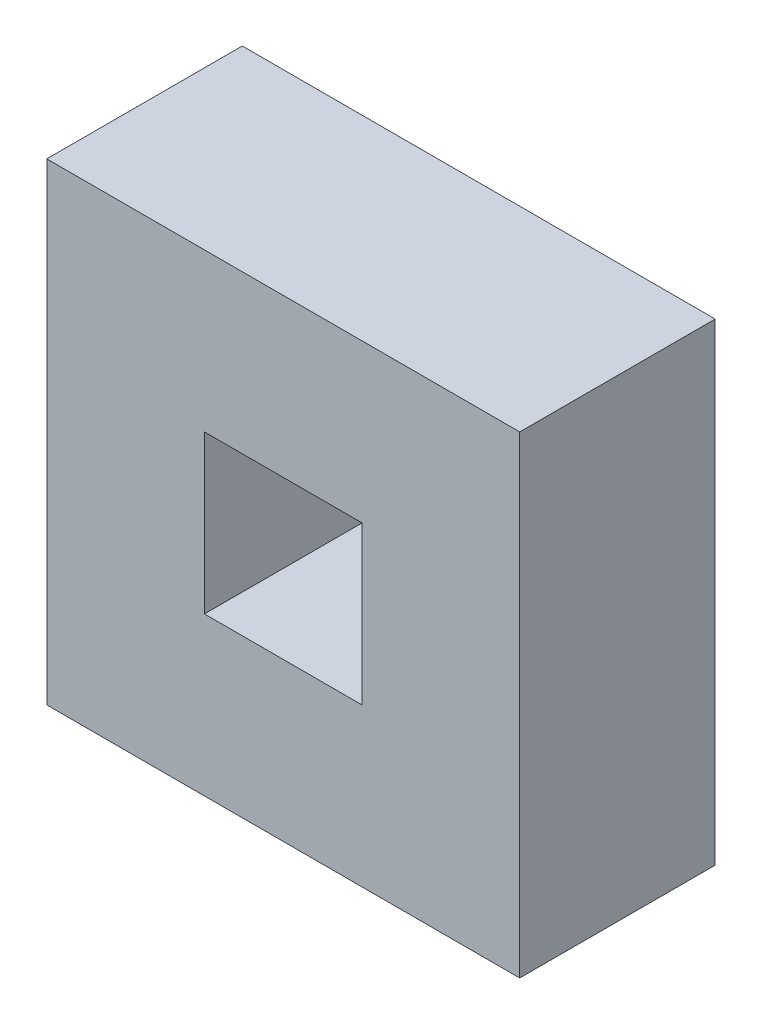
ISO-10303-21;
HEADER;
FILE_DESCRIPTION(('STEP AP214'),'2;1');
FILE_NAME('part.step','',(''),(''),'','','');
FILE_SCHEMA(('AUTOMOTIVE_DESIGN { 1 0 10303 214 1 1 1 1 }'));
ENDSEC;
DATA;
#1=APPLICATION_CONTEXT('core data for automotive mechanical design processes');
#2=APPLICATION_PROTOCOL_DEFINITION('international standard','automotive_design',2000,#1);
#3=PRODUCT_CONTEXT('',#1,'mechanical');
#4=PRODUCT('Part','Part','',(#3));
#5=PRODUCT_RELATED_PRODUCT_CATEGORY('part','',(#4));
#6=PRODUCT_DEFINITION_FORMATION('','',#4);
#7=PRODUCT_DEFINITION_CONTEXT('part definition',#1,'design');
#8=PRODUCT_DEFINITION('design','',#6,#7);
#9=PRODUCT_DEFINITION_SHAPE('','',#8);
#10=(LENGTH_UNIT() NAMED_UNIT(*) SI_UNIT(.MILLI.,.METRE.));
#11=(NAMED_UNIT(*) PLANE_ANGLE_UNIT() SI_UNIT($,.RADIAN.));
#12=(NAMED_UNIT(*) SI_UNIT($,.STERADIAN.) SOLID_ANGLE_UNIT());
#13=UNCERTAINTY_MEASURE_WITH_UNIT(LENGTH_MEASURE(1.E-05),#10,'distance_accuracy_value','');
#14=(GEOMETRIC_REPRESENTATION_CONTEXT(3) GLOBAL_UNCERTAINTY_ASSIGNED_CONTEXT((#13)) GLOBAL_UNIT_ASSIGNED_CONTEXT((#10,
#11,#12)) REPRESENTATION_CONTEXT('',''));
#15=CARTESIAN_POINT('',(0.,0.,0.));
#16=DIRECTION('',(0.,0.,1.));
#17=DIRECTION('',(1.,0.,0.));
#18=AXIS2_PLACEMENT_3D('',#15,#16,#17);
#19=CARTESIAN_POINT('',(0.,0.,12.4));
#20=DIRECTION('',(0.,0.,-1.));
#21=DIRECTION('',(-1.,0.,0.));
#22=AXIS2_PLACEMENT_3D('',#19,#20,#21);
#23=PLANE('',#22);
#24=DIRECTION('',(0.,-1.,0.));
#25=VECTOR('',#24,1.);
#26=CARTESIAN_POINT('',(0.,0.,12.4));
#27=LINE('',#26,#25);
#28=CARTESIAN_POINT('',(0.,30.,12.4));
#29=VERTEX_POINT('',#28);
#30=CARTESIAN_POINT('',(0.,0.,12.4));
#31=VERTEX_POINT('',#30);
#32=EDGE_CURVE('E134',#29,#31,#27,.T.);
#33=ORIENTED_EDGE('',*,*,#32,.T.);
#34=DIRECTION('',(1.,0.,0.));
#35=VECTOR('',#34,1.);
#36=CARTESIAN_POINT('',(0.,0.,12.4));
#37=LINE('',#36,#35);
#38=CARTESIAN_POINT('',(30.,0.,12.4));
#39=VERTEX_POINT('',#38);
#40=EDGE_CURVE('E137',#31,#39,#37,.T.);
#41=ORIENTED_EDGE('',*,*,#40,.T.);
#42=DIRECTION('',(0.,1.,0.));
#43=VECTOR('',#42,1.);
#44=CARTESIAN_POINT('',(30.,0.,12.4));
#45=LINE('',#44,#43);
#46=CARTESIAN_POINT('',(30.,30.,12.4));
#47=VERTEX_POINT('',#46);
#48=EDGE_CURVE('E140',#39,#47,#45,.T.);
#49=ORIENTED_EDGE('',*,*,#48,.T.);
#50=DIRECTION('',(-1.,0.,0.));
#51=VECTOR('',#50,1.);
#52=CARTESIAN_POINT('',(0.,30.,12.4));
#53=LINE('',#52,#51);
#54=EDGE_CURVE('E142',#47,#29,#53,.T.);
#55=ORIENTED_EDGE('',*,*,#54,.T.);
#56=EDGE_LOOP('',(#33,#41,#49,#55));
#57=FACE_BOUND('',#56,.T.);
#58=DIRECTION('',(0.,-1.,0.));
#59=VECTOR('',#58,1.);
#60=CARTESIAN_POINT('',(10.,20.,12.4));
#61=LINE('',#60,#59);
#62=CARTESIAN_POINT('',(10.,20.,12.4));
#63=VERTEX_POINT('',#62);
#64=CARTESIAN_POINT('',(10.,10.,12.4));
#65=VERTEX_POINT('',#64);
#66=EDGE_CURVE('E98',#63,#65,#61,.T.);
#67=ORIENTED_EDGE('',*,*,#66,.F.);
#68=DIRECTION('',(-1.,0.,0.));
#69=VECTOR('',#68,1.);
#70=CARTESIAN_POINT('',(10.,20.,12.4));
#71=LINE('',#70,#69);
#72=CARTESIAN_POINT('',(20.,20.,12.4));
#73=VERTEX_POINT('',#72);
#74=EDGE_CURVE('E120',#73,#63,#71,.T.);
#75=ORIENTED_EDGE('',*,*,#74,.F.);
#76=DIRECTION('',(0.,1.,0.));
#77=VECTOR('',#76,1.);
#78=CARTESIAN_POINT('',(20.,20.,12.4));
#79=LINE('',#78,#77);
#80=CARTESIAN_POINT('',(20.,10.,12.4));
#81=VERTEX_POINT('',#80);
#82=EDGE_CURVE('E118',#81,#73,#79,.T.);
#83=ORIENTED_EDGE('',*,*,#82,.F.);
#84=DIRECTION('',(1.,0.,0.));
#85=VECTOR('',#84,1.);
#86=CARTESIAN_POINT('',(10.,10.,12.4));
#87=LINE('',#86,#85);
#88=EDGE_CURVE('E106',#65,#81,#87,.T.);
#89=ORIENTED_EDGE('',*,*,#88,.F.);
#90=EDGE_LOOP('',(#67,#75,#83,#89));
#91=FACE_BOUND('',#90,.T.);
#92=ADVANCED_FACE('F33',(#57,#91),#23,.F.);
#93=CARTESIAN_POINT('',(0.,0.,0.));
#94=DIRECTION('',(0.,0.,-1.));
#95=DIRECTION('',(-1.,0.,0.));
#96=AXIS2_PLACEMENT_3D('',#93,#94,#95);
#97=PLANE('',#96);
#98=DIRECTION('',(0.,-1.,0.));
#99=VECTOR('',#98,1.);
#100=CARTESIAN_POINT('',(0.,0.,0.));
#101=LINE('',#100,#99);
#102=CARTESIAN_POINT('',(0.,30.,0.));
#103=VERTEX_POINT('',#102);
#104=CARTESIAN_POINT('',(0.,0.,0.));
#105=VERTEX_POINT('',#104);
#106=EDGE_CURVE('E114',#103,#105,#101,.T.);
#107=ORIENTED_EDGE('',*,*,#106,.F.);
#108=DIRECTION('',(-1.,0.,0.));
#109=VECTOR('',#108,1.);
#110=CARTESIAN_POINT('',(0.,30.,0.));
#111=LINE('',#110,#109);
#112=CARTESIAN_POINT('',(30.,30.,0.));
#113=VERTEX_POINT('',#112);
#114=EDGE_CURVE('E138',#113,#103,#111,.T.);
#115=ORIENTED_EDGE('',*,*,#114,.F.);
#116=DIRECTION('',(0.,1.,0.));
#117=VECTOR('',#116,1.);
#118=CARTESIAN_POINT('',(30.,0.,0.));
#119=LINE('',#118,#117);
#120=CARTESIAN_POINT('',(30.,0.,0.));
#121=VERTEX_POINT('',#120);
#122=EDGE_CURVE('E149',#121,#113,#119,.T.);
#123=ORIENTED_EDGE('',*,*,#122,.F.);
#124=DIRECTION('',(1.,0.,0.));
#125=VECTOR('',#124,1.);
#126=CARTESIAN_POINT('',(0.,0.,0.));
#127=LINE('',#126,#125);
#128=EDGE_CURVE('E147',#105,#121,#127,.T.);
#129=ORIENTED_EDGE('',*,*,#128,.F.);
#130=EDGE_LOOP('',(#107,#115,#123,#129));
#131=FACE_BOUND('',#130,.T.);
#132=DIRECTION('',(-1.,0.,0.));
#133=VECTOR('',#132,1.);
#134=CARTESIAN_POINT('',(10.,20.,0.));
#135=LINE('',#134,#133);
#136=CARTESIAN_POINT('',(20.,20.,0.));
#137=VERTEX_POINT('',#136);
#138=CARTESIAN_POINT('',(10.,20.,0.));
#139=VERTEX_POINT('',#138);
#140=EDGE_CURVE('E107',#137,#139,#135,.T.);
#141=ORIENTED_EDGE('',*,*,#140,.T.);
#142=DIRECTION('',(0.,-1.,0.));
#143=VECTOR('',#142,1.);
#144=CARTESIAN_POINT('',(10.,20.,0.));
#145=LINE('',#144,#143);
#146=CARTESIAN_POINT('',(10.,10.,0.));
#147=VERTEX_POINT('',#146);
#148=EDGE_CURVE('E56',#139,#147,#145,.T.);
#149=ORIENTED_EDGE('',*,*,#148,.T.);
#150=DIRECTION('',(1.,0.,0.));
#151=VECTOR('',#150,1.);
#152=CARTESIAN_POINT('',(10.,10.,0.));
#153=LINE('',#152,#151);
#154=CARTESIAN_POINT('',(20.,10.,0.));
#155=VERTEX_POINT('',#154);
#156=EDGE_CURVE('E113',#147,#155,#153,.T.);
#157=ORIENTED_EDGE('',*,*,#156,.T.);
#158=DIRECTION('',(0.,1.,0.));
#159=VECTOR('',#158,1.);
#160=CARTESIAN_POINT('',(20.,20.,0.));
#161=LINE('',#160,#159);
#162=EDGE_CURVE('E126',#155,#137,#161,.T.);
#163=ORIENTED_EDGE('',*,*,#162,.T.);
#164=EDGE_LOOP('',(#141,#149,#157,#163));
#165=FACE_BOUND('',#164,.T.);
#166=ADVANCED_FACE('F167',(#131,#165),#97,.T.);
#167=CARTESIAN_POINT('',(0.,0.,12.4));
#168=DIRECTION('',(1.,0.,0.));
#169=DIRECTION('',(0.,0.,-1.));
#170=AXIS2_PLACEMENT_3D('',#167,#168,#169);
#171=PLANE('',#170);
#172=ORIENTED_EDGE('',*,*,#106,.T.);
#173=DIRECTION('',(0.,0.,-1.));
#174=VECTOR('',#173,1.);
#175=CARTESIAN_POINT('',(0.,0.,12.4));
#176=LINE('',#175,#174);
#177=EDGE_CURVE('E11',#31,#105,#176,.T.);
#178=ORIENTED_EDGE('',*,*,#177,.F.);
#179=ORIENTED_EDGE('',*,*,#32,.F.);
#180=DIRECTION('',(0.,0.,-1.));
#181=VECTOR('',#180,1.);
#182=CARTESIAN_POINT('',(0.,30.,12.4));
#183=LINE('',#182,#181);
#184=EDGE_CURVE('E144',#29,#103,#183,.T.);
#185=ORIENTED_EDGE('',*,*,#184,.T.);
#186=EDGE_LOOP('',(#172,#178,#179,#185));
#187=FACE_BOUND('',#186,.T.);
#188=ADVANCED_FACE('F35',(#187),#171,.F.);
#189=CARTESIAN_POINT('',(0.,0.,12.4));
#190=DIRECTION('',(0.,1.,0.));
#191=DIRECTION('',(0.,0.,1.));
#192=AXIS2_PLACEMENT_3D('',#189,#190,#191);
#193=PLANE('',#192);
#194=ORIENTED_EDGE('',*,*,#128,.T.);
#195=DIRECTION('',(0.,0.,-1.));
#196=VECTOR('',#195,1.);
#197=CARTESIAN_POINT('',(30.,0.,12.4));
#198=LINE('',#197,#196);
#199=EDGE_CURVE('E41',#39,#121,#198,.T.);
#200=ORIENTED_EDGE('',*,*,#199,.F.);
#201=ORIENTED_EDGE('',*,*,#40,.F.);
#202=ORIENTED_EDGE('',*,*,#177,.T.);
#203=EDGE_LOOP('',(#194,#200,#201,#202));
#204=FACE_BOUND('',#203,.T.);
#205=ADVANCED_FACE('F177',(#204),#193,.F.);
#206=CARTESIAN_POINT('',(30.,0.,12.4));
#207=DIRECTION('',(-1.,0.,0.));
#208=DIRECTION('',(0.,0.,1.));
#209=AXIS2_PLACEMENT_3D('',#206,#207,#208);
#210=PLANE('',#209);
#211=ORIENTED_EDGE('',*,*,#122,.T.);
#212=DIRECTION('',(0.,0.,-1.));
#213=VECTOR('',#212,1.);
#214=CARTESIAN_POINT('',(30.,30.,12.4));
#215=LINE('',#214,#213);
#216=EDGE_CURVE('E154',#47,#113,#215,.T.);
#217=ORIENTED_EDGE('',*,*,#216,.F.);
#218=ORIENTED_EDGE('',*,*,#48,.F.);
#219=ORIENTED_EDGE('',*,*,#199,.T.);
#220=EDGE_LOOP('',(#211,#217,#218,#219));
#221=FACE_BOUND('',#220,.T.);
#222=ADVANCED_FACE('F161',(#221),#210,.F.);
#223=CARTESIAN_POINT('',(0.,30.,12.4));
#224=DIRECTION('',(0.,-1.,0.));
#225=DIRECTION('',(0.,0.,-1.));
#226=AXIS2_PLACEMENT_3D('',#223,#224,#225);
#227=PLANE('',#226);
#228=ORIENTED_EDGE('',*,*,#114,.T.);
#229=ORIENTED_EDGE('',*,*,#184,.F.);
#230=ORIENTED_EDGE('',*,*,#54,.F.);
#231=ORIENTED_EDGE('',*,*,#216,.T.);
#232=EDGE_LOOP('',(#228,#229,#230,#231));
#233=FACE_BOUND('',#232,.T.);
#234=ADVANCED_FACE('F171',(#233),#227,.F.);
#235=CARTESIAN_POINT('',(10.,20.,12.4));
#236=DIRECTION('',(1.,0.,0.));
#237=DIRECTION('',(0.,0.,-1.));
#238=AXIS2_PLACEMENT_3D('',#235,#236,#237);
#239=PLANE('',#238);
#240=ORIENTED_EDGE('',*,*,#148,.F.);
#241=DIRECTION('',(0.,0.,-1.));
#242=VECTOR('',#241,1.);
#243=CARTESIAN_POINT('',(10.,20.,12.4));
#244=LINE('',#243,#242);
#245=EDGE_CURVE('E102',#63,#139,#244,.T.);
#246=ORIENTED_EDGE('',*,*,#245,.F.);
#247=ORIENTED_EDGE('',*,*,#66,.T.);
#248=DIRECTION('',(0.,0.,-1.));
#249=VECTOR('',#248,1.);
#250=CARTESIAN_POINT('',(10.,10.,12.4));
#251=LINE('',#250,#249);
#252=EDGE_CURVE('E101',#65,#147,#251,.T.);
#253=ORIENTED_EDGE('',*,*,#252,.T.);
#254=EDGE_LOOP('',(#240,#246,#247,#253));
#255=FACE_BOUND('',#254,.T.);
#256=ADVANCED_FACE('F100',(#255),#239,.T.);
#257=CARTESIAN_POINT('',(10.,10.,12.4));
#258=DIRECTION('',(0.,1.,0.));
#259=DIRECTION('',(0.,0.,1.));
#260=AXIS2_PLACEMENT_3D('',#257,#258,#259);
#261=PLANE('',#260);
#262=ORIENTED_EDGE('',*,*,#156,.F.);
#263=ORIENTED_EDGE('',*,*,#252,.F.);
#264=ORIENTED_EDGE('',*,*,#88,.T.);
#265=DIRECTION('',(0.,0.,-1.));
#266=VECTOR('',#265,1.);
#267=CARTESIAN_POINT('',(20.,10.,12.4));
#268=LINE('',#267,#266);
#269=EDGE_CURVE('E115',#81,#155,#268,.T.);
#270=ORIENTED_EDGE('',*,*,#269,.T.);
#271=EDGE_LOOP('',(#262,#263,#264,#270));
#272=FACE_BOUND('',#271,.T.);
#273=ADVANCED_FACE('F110',(#272),#261,.T.);
#274=CARTESIAN_POINT('',(20.,20.,12.4));
#275=DIRECTION('',(-1.,0.,0.));
#276=DIRECTION('',(0.,0.,1.));
#277=AXIS2_PLACEMENT_3D('',#274,#275,#276);
#278=PLANE('',#277);
#279=ORIENTED_EDGE('',*,*,#162,.F.);
#280=ORIENTED_EDGE('',*,*,#269,.F.);
#281=ORIENTED_EDGE('',*,*,#82,.T.);
#282=DIRECTION('',(0.,0.,-1.));
#283=VECTOR('',#282,1.);
#284=CARTESIAN_POINT('',(20.,20.,12.4));
#285=LINE('',#284,#283);
#286=EDGE_CURVE('E48',#73,#137,#285,.T.);
#287=ORIENTED_EDGE('',*,*,#286,.T.);
#288=EDGE_LOOP('',(#279,#280,#281,#287));
#289=FACE_BOUND('',#288,.T.);
#290=ADVANCED_FACE('F200',(#289),#278,.T.);
#291=CARTESIAN_POINT('',(10.,20.,12.4));
#292=DIRECTION('',(0.,-1.,0.));
#293=DIRECTION('',(0.,0.,-1.));
#294=AXIS2_PLACEMENT_3D('',#291,#292,#293);
#295=PLANE('',#294);
#296=ORIENTED_EDGE('',*,*,#140,.F.);
#297=ORIENTED_EDGE('',*,*,#286,.F.);
#298=ORIENTED_EDGE('',*,*,#74,.T.);
#299=ORIENTED_EDGE('',*,*,#245,.T.);
#300=EDGE_LOOP('',(#296,#297,#298,#299));
#301=FACE_BOUND('',#300,.T.);
#302=ADVANCED_FACE('F204',(#301),#295,.T.);
#303=CLOSED_SHELL('',(#92,#166,#188,#205,#222,#234,#256,#273,#290,#302));
#304=MANIFOLD_SOLID_BREP('B2',#303);
#305=ADVANCED_BREP_SHAPE_REPRESENTATION('',(#18,#304),#14);
#306=SHAPE_DEFINITION_REPRESENTATION(#9,#305);
ENDSEC;
END-ISO-10303-21;
